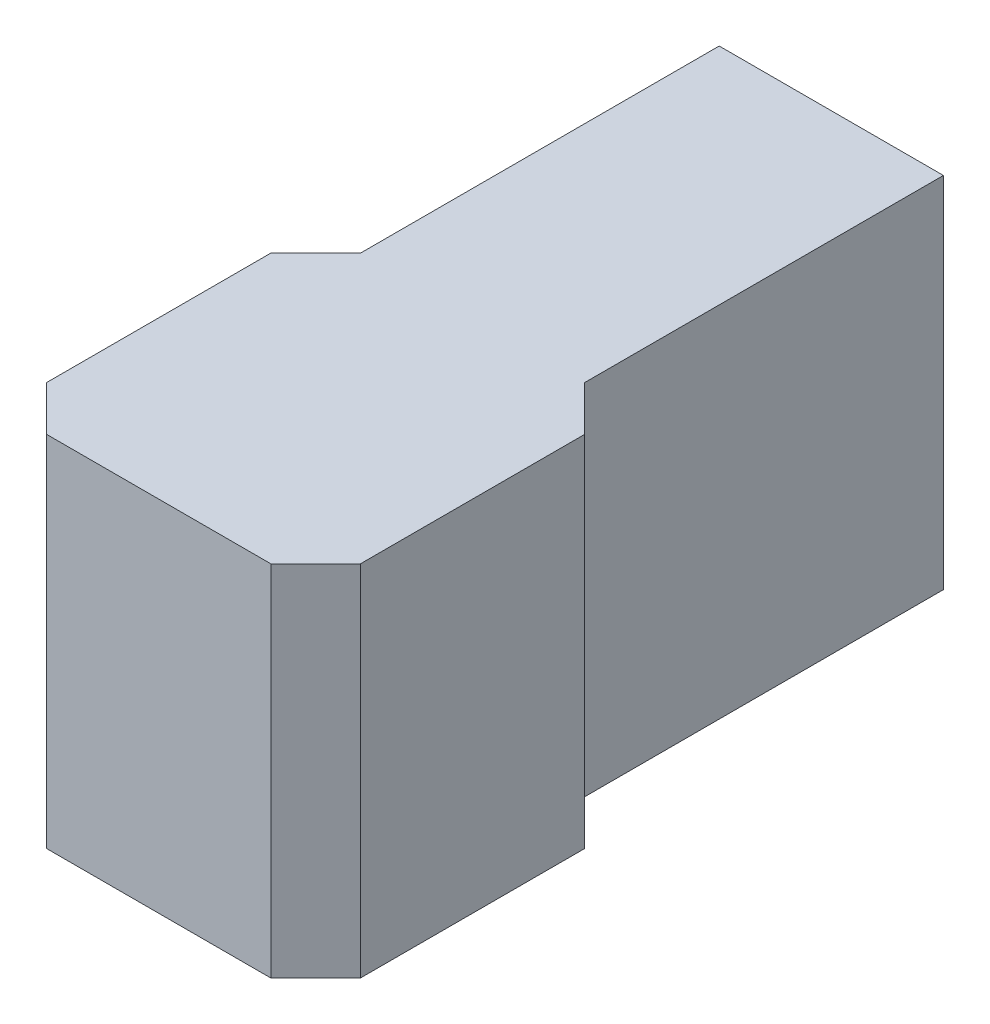
ISO-10303-21;
HEADER;
FILE_DESCRIPTION(('STEP AP214'),'2;1');
FILE_NAME('part.step','',(''),(''),'','','');
FILE_SCHEMA(('AUTOMOTIVE_DESIGN { 1 0 10303 214 1 1 1 1 }'));
ENDSEC;
DATA;
#1=APPLICATION_CONTEXT('core data for automotive mechanical design processes');
#2=APPLICATION_PROTOCOL_DEFINITION('international standard','automotive_design',2000,#1);
#3=PRODUCT_CONTEXT('',#1,'mechanical');
#4=PRODUCT('Part','Part','',(#3));
#5=PRODUCT_RELATED_PRODUCT_CATEGORY('part','',(#4));
#6=PRODUCT_DEFINITION_FORMATION('','',#4);
#7=PRODUCT_DEFINITION_CONTEXT('part definition',#1,'design');
#8=PRODUCT_DEFINITION('design','',#6,#7);
#9=PRODUCT_DEFINITION_SHAPE('','',#8);
#10=(LENGTH_UNIT() NAMED_UNIT(*) SI_UNIT(.MILLI.,.METRE.));
#11=(NAMED_UNIT(*) PLANE_ANGLE_UNIT() SI_UNIT($,.RADIAN.));
#12=(NAMED_UNIT(*) SI_UNIT($,.STERADIAN.) SOLID_ANGLE_UNIT());
#13=UNCERTAINTY_MEASURE_WITH_UNIT(LENGTH_MEASURE(1.E-05),#10,'distance_accuracy_value','');
#14=(GEOMETRIC_REPRESENTATION_CONTEXT(3) GLOBAL_UNCERTAINTY_ASSIGNED_CONTEXT((#13)) GLOBAL_UNIT_ASSIGNED_CONTEXT((#10,
#11,#12)) REPRESENTATION_CONTEXT('',''));
#15=CARTESIAN_POINT('',(0.,0.,0.));
#16=DIRECTION('',(0.,0.,1.));
#17=DIRECTION('',(1.,0.,0.));
#18=AXIS2_PLACEMENT_3D('',#15,#16,#17);
#19=CARTESIAN_POINT('',(0.,60.,5.));
#20=DIRECTION('',(0.,-1.,0.));
#21=DIRECTION('',(0.,0.,-1.));
#22=AXIS2_PLACEMENT_3D('',#19,#20,#21);
#23=PLANE('',#22);
#24=DIRECTION('',(0.,0.,-1.));
#25=VECTOR('',#24,1.);
#26=CARTESIAN_POINT('',(6.,60.,5.));
#27=LINE('',#26,#25);
#28=CARTESIAN_POINT('',(6.,60.,5.));
#29=VERTEX_POINT('',#28);
#30=CARTESIAN_POINT('',(6.,60.,-115.));
#31=VERTEX_POINT('',#30);
#32=EDGE_CURVE('E178',#29,#31,#27,.T.);
#33=ORIENTED_EDGE('',*,*,#32,.T.);
#34=DIRECTION('',(-1.,0.,0.));
#35=VECTOR('',#34,1.);
#36=CARTESIAN_POINT('',(6.,60.,-115.));
#37=LINE('',#36,#35);
#38=CARTESIAN_POINT('',(4.49999999999999,60.,-115.));
#39=VERTEX_POINT('',#38);
#40=EDGE_CURVE('E177',#31,#39,#37,.T.);
#41=ORIENTED_EDGE('',*,*,#40,.T.);
#42=DIRECTION('',(0.,0.,-1.));
#43=VECTOR('',#42,1.);
#44=CARTESIAN_POINT('',(4.5,60.,5.));
#45=LINE('',#44,#43);
#46=CARTESIAN_POINT('',(4.5,60.,5.));
#47=VERTEX_POINT('',#46);
#48=EDGE_CURVE('E162',#47,#39,#45,.T.);
#49=ORIENTED_EDGE('',*,*,#48,.F.);
#50=DIRECTION('',(-1.,0.,0.));
#51=VECTOR('',#50,1.);
#52=CARTESIAN_POINT('',(0.,60.,5.));
#53=LINE('',#52,#51);
#54=EDGE_CURVE('E225',#29,#47,#53,.T.);
#55=ORIENTED_EDGE('',*,*,#54,.F.);
#56=EDGE_LOOP('',(#33,#41,#49,#55));
#57=FACE_BOUND('',#56,.T.);
#58=ADVANCED_FACE('F35',(#57),#23,.F.);
#59=CARTESIAN_POINT('',(6.00000000000001,0.,5.));
#60=DIRECTION('',(-1.,0.,0.));
#61=DIRECTION('',(0.,-1.,0.));
#62=AXIS2_PLACEMENT_3D('',#59,#60,#61);
#63=PLANE('',#62);
#64=DIRECTION('',(0.,0.,-1.));
#65=VECTOR('',#64,1.);
#66=CARTESIAN_POINT('',(6.,70.,5.));
#67=LINE('',#66,#65);
#68=CARTESIAN_POINT('',(6.,70.,5.));
#69=VERTEX_POINT('',#68);
#70=CARTESIAN_POINT('',(6.,70.,-115.));
#71=VERTEX_POINT('',#70);
#72=EDGE_CURVE('E242',#69,#71,#67,.T.);
#73=ORIENTED_EDGE('',*,*,#72,.T.);
#74=DIRECTION('',(0.,-1.,0.));
#75=VECTOR('',#74,1.);
#76=CARTESIAN_POINT('',(6.,60.,-115.));
#77=LINE('',#76,#75);
#78=EDGE_CURVE('E202',#71,#31,#77,.T.);
#79=ORIENTED_EDGE('',*,*,#78,.T.);
#80=ORIENTED_EDGE('',*,*,#32,.F.);
#81=DIRECTION('',(0.,1.,0.));
#82=VECTOR('',#81,1.);
#83=CARTESIAN_POINT('',(6.00000000000001,0.,5.));
#84=LINE('',#83,#82);
#85=EDGE_CURVE('E174',#29,#69,#84,.T.);
#86=ORIENTED_EDGE('',*,*,#85,.T.);
#87=EDGE_LOOP('',(#73,#79,#80,#86));
#88=FACE_BOUND('',#87,.T.);
#89=ADVANCED_FACE('F348',(#88),#63,.T.);
#90=CARTESIAN_POINT('',(0.,70.,5.));
#91=DIRECTION('',(0.,-1.,0.));
#92=DIRECTION('',(0.,0.,-1.));
#93=AXIS2_PLACEMENT_3D('',#90,#91,#92);
#94=PLANE('',#93);
#95=DIRECTION('',(0.,0.,-1.));
#96=VECTOR('',#95,1.);
#97=CARTESIAN_POINT('',(-6.,70.,5.));
#98=LINE('',#97,#96);
#99=CARTESIAN_POINT('',(-6.,70.,5.));
#100=VERTEX_POINT('',#99);
#101=CARTESIAN_POINT('',(-6.,70.,-115.));
#102=VERTEX_POINT('',#101);
#103=EDGE_CURVE('E244',#100,#102,#98,.T.);
#104=ORIENTED_EDGE('',*,*,#103,.T.);
#105=DIRECTION('',(1.,0.,0.));
#106=VECTOR('',#105,1.);
#107=CARTESIAN_POINT('',(6.,70.,-115.));
#108=LINE('',#107,#106);
#109=EDGE_CURVE('E199',#102,#71,#108,.T.);
#110=ORIENTED_EDGE('',*,*,#109,.T.);
#111=ORIENTED_EDGE('',*,*,#72,.F.);
#112=DIRECTION('',(-1.,0.,0.));
#113=VECTOR('',#112,1.);
#114=CARTESIAN_POINT('',(0.,70.,5.));
#115=LINE('',#114,#113);
#116=EDGE_CURVE('E237',#69,#100,#115,.T.);
#117=ORIENTED_EDGE('',*,*,#116,.T.);
#118=EDGE_LOOP('',(#104,#110,#111,#117));
#119=FACE_BOUND('',#118,.T.);
#120=ADVANCED_FACE('F354',(#119),#94,.T.);
#121=CARTESIAN_POINT('',(-5.99999999999999,0.,5.));
#122=DIRECTION('',(-1.,0.,0.));
#123=DIRECTION('',(0.,-1.,0.));
#124=AXIS2_PLACEMENT_3D('',#121,#122,#123);
#125=PLANE('',#124);
#126=DIRECTION('',(0.,0.,-1.));
#127=VECTOR('',#126,1.);
#128=CARTESIAN_POINT('',(-6.,60.,5.));
#129=LINE('',#128,#127);
#130=CARTESIAN_POINT('',(-6.,60.,5.));
#131=VERTEX_POINT('',#130);
#132=CARTESIAN_POINT('',(-6.,60.,-115.));
#133=VERTEX_POINT('',#132);
#134=EDGE_CURVE('E246',#131,#133,#129,.T.);
#135=ORIENTED_EDGE('',*,*,#134,.T.);
#136=DIRECTION('',(0.,1.,0.));
#137=VECTOR('',#136,1.);
#138=CARTESIAN_POINT('',(-6.,60.,-115.));
#139=LINE('',#138,#137);
#140=EDGE_CURVE('E196',#133,#102,#139,.T.);
#141=ORIENTED_EDGE('',*,*,#140,.T.);
#142=ORIENTED_EDGE('',*,*,#103,.F.);
#143=DIRECTION('',(0.,1.,0.));
#144=VECTOR('',#143,1.);
#145=CARTESIAN_POINT('',(-5.99999999999999,0.,5.));
#146=LINE('',#145,#144);
#147=EDGE_CURVE('E234',#131,#100,#146,.T.);
#148=ORIENTED_EDGE('',*,*,#147,.F.);
#149=EDGE_LOOP('',(#135,#141,#142,#148));
#150=FACE_BOUND('',#149,.T.);
#151=ADVANCED_FACE('F361',(#150),#125,.F.);
#152=DIRECTION('',(0.,0.,-1.));
#153=VECTOR('',#152,1.);
#154=CARTESIAN_POINT('',(-4.5,60.,5.));
#155=LINE('',#154,#153);
#156=CARTESIAN_POINT('',(-4.5,60.,5.));
#157=VERTEX_POINT('',#156);
#158=CARTESIAN_POINT('',(-4.5,60.,-115.));
#159=VERTEX_POINT('',#158);
#160=EDGE_CURVE('E248',#157,#159,#155,.T.);
#161=ORIENTED_EDGE('',*,*,#160,.T.);
#162=DIRECTION('',(-1.,0.,0.));
#163=VECTOR('',#162,1.);
#164=CARTESIAN_POINT('',(-4.5,60.,-115.));
#165=LINE('',#164,#163);
#166=EDGE_CURVE('E193',#159,#133,#165,.T.);
#167=ORIENTED_EDGE('',*,*,#166,.T.);
#168=ORIENTED_EDGE('',*,*,#134,.F.);
#169=EDGE_CURVE('E227',#157,#131,#53,.T.);
#170=ORIENTED_EDGE('',*,*,#169,.F.);
#171=EDGE_LOOP('',(#161,#167,#168,#170));
#172=FACE_BOUND('',#171,.T.);
#173=ADVANCED_FACE('F350',(#172),#23,.F.);
#174=CARTESIAN_POINT('',(-4.49999999999999,0.,5.));
#175=DIRECTION('',(1.,0.,0.));
#176=DIRECTION('',(0.,1.,0.));
#177=AXIS2_PLACEMENT_3D('',#174,#175,#176);
#178=PLANE('',#177);
#179=DIRECTION('',(0.,0.,-1.));
#180=VECTOR('',#179,1.);
#181=CARTESIAN_POINT('',(-4.5,25.,5.));
#182=LINE('',#181,#180);
#183=CARTESIAN_POINT('',(-4.5,25.,5.));
#184=VERTEX_POINT('',#183);
#185=CARTESIAN_POINT('',(-4.5,25.,-115.));
#186=VERTEX_POINT('',#185);
#187=EDGE_CURVE('E250',#184,#186,#182,.T.);
#188=ORIENTED_EDGE('',*,*,#187,.T.);
#189=DIRECTION('',(0.,1.,0.));
#190=VECTOR('',#189,1.);
#191=CARTESIAN_POINT('',(-4.5,60.,-115.));
#192=LINE('',#191,#190);
#193=EDGE_CURVE('E188',#186,#159,#192,.T.);
#194=ORIENTED_EDGE('',*,*,#193,.T.);
#195=ORIENTED_EDGE('',*,*,#160,.F.);
#196=DIRECTION('',(0.,-1.,0.));
#197=VECTOR('',#196,1.);
#198=CARTESIAN_POINT('',(-4.49999999999999,0.,5.));
#199=LINE('',#198,#197);
#200=EDGE_CURVE('E232',#157,#184,#199,.T.);
#201=ORIENTED_EDGE('',*,*,#200,.T.);
#202=EDGE_LOOP('',(#188,#194,#195,#201));
#203=FACE_BOUND('',#202,.T.);
#204=ADVANCED_FACE('F360',(#203),#178,.T.);
#205=CARTESIAN_POINT('',(0.,25.,5.));
#206=DIRECTION('',(0.,-1.,0.));
#207=DIRECTION('',(0.,0.,-1.));
#208=AXIS2_PLACEMENT_3D('',#205,#206,#207);
#209=PLANE('',#208);
#210=DIRECTION('',(0.,0.,-1.));
#211=VECTOR('',#210,1.);
#212=CARTESIAN_POINT('',(4.5,25.,5.));
#213=LINE('',#212,#211);
#214=CARTESIAN_POINT('',(4.5,25.,5.));
#215=VERTEX_POINT('',#214);
#216=CARTESIAN_POINT('',(4.5,25.,-115.));
#217=VERTEX_POINT('',#216);
#218=EDGE_CURVE('E173',#215,#217,#213,.T.);
#219=ORIENTED_EDGE('',*,*,#218,.T.);
#220=DIRECTION('',(-1.,0.,0.));
#221=VECTOR('',#220,1.);
#222=CARTESIAN_POINT('',(4.5,25.,-115.));
#223=LINE('',#222,#221);
#224=EDGE_CURVE('E186',#217,#186,#223,.T.);
#225=ORIENTED_EDGE('',*,*,#224,.T.);
#226=ORIENTED_EDGE('',*,*,#187,.F.);
#227=DIRECTION('',(-1.,0.,0.));
#228=VECTOR('',#227,1.);
#229=CARTESIAN_POINT('',(0.,25.,5.));
#230=LINE('',#229,#228);
#231=EDGE_CURVE('E229',#215,#184,#230,.T.);
#232=ORIENTED_EDGE('',*,*,#231,.F.);
#233=EDGE_LOOP('',(#219,#225,#226,#232));
#234=FACE_BOUND('',#233,.T.);
#235=ADVANCED_FACE('F367',(#234),#209,.F.);
#236=CARTESIAN_POINT('',(4.49999999999999,0.,5.));
#237=DIRECTION('',(1.,0.,0.));
#238=DIRECTION('',(0.,1.,0.));
#239=AXIS2_PLACEMENT_3D('',#236,#237,#238);
#240=PLANE('',#239);
#241=ORIENTED_EDGE('',*,*,#48,.T.);
#242=DIRECTION('',(0.,-1.,0.));
#243=VECTOR('',#242,1.);
#244=CARTESIAN_POINT('',(4.49999999999999,60.,-115.));
#245=LINE('',#244,#243);
#246=EDGE_CURVE('E166',#39,#217,#245,.T.);
#247=ORIENTED_EDGE('',*,*,#246,.T.);
#248=ORIENTED_EDGE('',*,*,#218,.F.);
#249=DIRECTION('',(0.,-1.,0.));
#250=VECTOR('',#249,1.);
#251=CARTESIAN_POINT('',(4.49999999999999,0.,5.));
#252=LINE('',#251,#250);
#253=EDGE_CURVE('E169',#47,#215,#252,.T.);
#254=ORIENTED_EDGE('',*,*,#253,.F.);
#255=EDGE_LOOP('',(#241,#247,#248,#254));
#256=FACE_BOUND('',#255,.T.);
#257=ADVANCED_FACE('F164',(#256),#240,.F.);
#258=CARTESIAN_POINT('',(0.,0.,5.));
#259=DIRECTION('',(0.,0.,-1.));
#260=DIRECTION('',(-1.,0.,0.));
#261=AXIS2_PLACEMENT_3D('',#258,#259,#260);
#262=PLANE('',#261);
#263=ORIENTED_EDGE('',*,*,#54,.T.);
#264=ORIENTED_EDGE('',*,*,#253,.T.);
#265=ORIENTED_EDGE('',*,*,#231,.T.);
#266=ORIENTED_EDGE('',*,*,#200,.F.);
#267=ORIENTED_EDGE('',*,*,#169,.T.);
#268=ORIENTED_EDGE('',*,*,#147,.T.);
#269=ORIENTED_EDGE('',*,*,#116,.F.);
#270=ORIENTED_EDGE('',*,*,#85,.F.);
#271=EDGE_LOOP('',(#263,#264,#265,#266,#267,#268,#269,#270));
#272=FACE_BOUND('',#271,.T.);
#273=ADVANCED_FACE('F381',(#272),#262,.T.);
#274=CARTESIAN_POINT('',(0.,0.,-115.));
#275=DIRECTION('',(0.,0.,-1.));
#276=DIRECTION('',(-1.,0.,0.));
#277=AXIS2_PLACEMENT_3D('',#274,#275,#276);
#278=PLANE('',#277);
#279=DIRECTION('',(0.,-1.,0.));
#280=VECTOR('',#279,1.);
#281=CARTESIAN_POINT('',(25.,80.,-115.));
#282=LINE('',#281,#280);
#283=CARTESIAN_POINT('',(25.,80.,-115.));
#284=VERTEX_POINT('',#283);
#285=CARTESIAN_POINT('',(25.,0.,-115.));
#286=VERTEX_POINT('',#285);
#287=EDGE_CURVE('E204',#284,#286,#282,.T.);
#288=ORIENTED_EDGE('',*,*,#287,.T.);
#289=DIRECTION('',(-1.,0.,0.));
#290=VECTOR('',#289,1.);
#291=CARTESIAN_POINT('',(25.,0.,-115.));
#292=LINE('',#291,#290);
#293=CARTESIAN_POINT('',(-25.,0.,-115.));
#294=VERTEX_POINT('',#293);
#295=EDGE_CURVE('E207',#286,#294,#292,.T.);
#296=ORIENTED_EDGE('',*,*,#295,.T.);
#297=DIRECTION('',(0.,1.,0.));
#298=VECTOR('',#297,1.);
#299=CARTESIAN_POINT('',(-25.,0.,-115.));
#300=LINE('',#299,#298);
#301=CARTESIAN_POINT('',(-25.,80.,-115.));
#302=VERTEX_POINT('',#301);
#303=EDGE_CURVE('E209',#294,#302,#300,.T.);
#304=ORIENTED_EDGE('',*,*,#303,.T.);
#305=DIRECTION('',(1.,0.,0.));
#306=VECTOR('',#305,1.);
#307=CARTESIAN_POINT('',(-25.,80.,-115.));
#308=LINE('',#307,#306);
#309=EDGE_CURVE('E211',#302,#284,#308,.T.);
#310=ORIENTED_EDGE('',*,*,#309,.T.);
#311=EDGE_LOOP('',(#288,#296,#304,#310));
#312=FACE_BOUND('',#311,.T.);
#313=ORIENTED_EDGE('',*,*,#246,.F.);
#314=ORIENTED_EDGE('',*,*,#40,.F.);
#315=ORIENTED_EDGE('',*,*,#78,.F.);
#316=ORIENTED_EDGE('',*,*,#109,.F.);
#317=ORIENTED_EDGE('',*,*,#140,.F.);
#318=ORIENTED_EDGE('',*,*,#166,.F.);
#319=ORIENTED_EDGE('',*,*,#193,.F.);
#320=ORIENTED_EDGE('',*,*,#224,.F.);
#321=EDGE_LOOP('',(#313,#314,#315,#316,#317,#318,#319,#320));
#322=FACE_BOUND('',#321,.T.);
#323=ADVANCED_FACE('F183',(#312,#322),#278,.T.);
#324=CARTESIAN_POINT('',(25.,80.,-115.));
#325=DIRECTION('',(-1.,0.,0.));
#326=DIRECTION('',(0.,0.,1.));
#327=AXIS2_PLACEMENT_3D('',#324,#325,#326);
#328=PLANE('',#327);
#329=DIRECTION('',(0.,-1.,0.));
#330=VECTOR('',#329,1.);
#331=CARTESIAN_POINT('',(25.,80.,-35.));
#332=LINE('',#331,#330);
#333=CARTESIAN_POINT('',(25.,80.,-35.));
#334=VERTEX_POINT('',#333);
#335=CARTESIAN_POINT('',(25.,0.,-35.));
#336=VERTEX_POINT('',#335);
#337=EDGE_CURVE('E280',#334,#336,#332,.T.);
#338=ORIENTED_EDGE('',*,*,#337,.T.);
#339=DIRECTION('',(0.,0.,1.));
#340=VECTOR('',#339,1.);
#341=CARTESIAN_POINT('',(25.,0.,-115.));
#342=LINE('',#341,#340);
#343=EDGE_CURVE('E222',#286,#336,#342,.T.);
#344=ORIENTED_EDGE('',*,*,#343,.F.);
#345=ORIENTED_EDGE('',*,*,#287,.F.);
#346=DIRECTION('',(0.,0.,1.));
#347=VECTOR('',#346,1.);
#348=CARTESIAN_POINT('',(25.,80.,-115.));
#349=LINE('',#348,#347);
#350=EDGE_CURVE('E213',#284,#334,#349,.T.);
#351=ORIENTED_EDGE('',*,*,#350,.T.);
#352=EDGE_LOOP('',(#338,#344,#345,#351));
#353=FACE_BOUND('',#352,.T.);
#354=ADVANCED_FACE('F313',(#353),#328,.F.);
#355=CARTESIAN_POINT('',(-25.,0.,-115.));
#356=DIRECTION('',(1.,0.,0.));
#357=DIRECTION('',(0.,0.,-1.));
#358=AXIS2_PLACEMENT_3D('',#355,#356,#357);
#359=PLANE('',#358);
#360=DIRECTION('',(0.,1.,0.));
#361=VECTOR('',#360,1.);
#362=CARTESIAN_POINT('',(-25.,80.,-35.));
#363=LINE('',#362,#361);
#364=CARTESIAN_POINT('',(-25.,0.,-35.));
#365=VERTEX_POINT('',#364);
#366=CARTESIAN_POINT('',(-25.,80.,-35.));
#367=VERTEX_POINT('',#366);
#368=EDGE_CURVE('E283',#365,#367,#363,.T.);
#369=ORIENTED_EDGE('',*,*,#368,.T.);
#370=DIRECTION('',(0.,0.,1.));
#371=VECTOR('',#370,1.);
#372=CARTESIAN_POINT('',(-25.,80.,-115.));
#373=LINE('',#372,#371);
#374=EDGE_CURVE('E216',#302,#367,#373,.T.);
#375=ORIENTED_EDGE('',*,*,#374,.F.);
#376=ORIENTED_EDGE('',*,*,#303,.F.);
#377=DIRECTION('',(0.,0.,1.));
#378=VECTOR('',#377,1.);
#379=CARTESIAN_POINT('',(-25.,0.,-115.));
#380=LINE('',#379,#378);
#381=EDGE_CURVE('E219',#294,#365,#380,.T.);
#382=ORIENTED_EDGE('',*,*,#381,.T.);
#383=EDGE_LOOP('',(#369,#375,#376,#382));
#384=FACE_BOUND('',#383,.T.);
#385=ADVANCED_FACE('F320',(#384),#359,.F.);
#386=CARTESIAN_POINT('',(35.,80.,25.));
#387=DIRECTION('',(-0.707106781186547,0.,-0.707106781186549));
#388=DIRECTION('',(0.,-1.,0.));
#389=AXIS2_PLACEMENT_3D('',#386,#387,#388);
#390=PLANE('',#389);
#391=DIRECTION('',(-0.707106781186549,0.,0.707106781186547));
#392=VECTOR('',#391,1.);
#393=CARTESIAN_POINT('',(30.,80.,30.));
#394=LINE('',#393,#392);
#395=CARTESIAN_POINT('',(25.,80.,35.));
#396=VERTEX_POINT('',#395);
#397=CARTESIAN_POINT('',(35.,80.,25.));
#398=VERTEX_POINT('',#397);
#399=EDGE_CURVE('E286',#396,#398,#394,.F.);
#400=ORIENTED_EDGE('',*,*,#399,.F.);
#401=DIRECTION('',(0.,1.,0.));
#402=VECTOR('',#401,1.);
#403=CARTESIAN_POINT('',(25.,80.,35.));
#404=LINE('',#403,#402);
#405=CARTESIAN_POINT('',(25.,0.,35.));
#406=VERTEX_POINT('',#405);
#407=EDGE_CURVE('E44',#406,#396,#404,.T.);
#408=ORIENTED_EDGE('',*,*,#407,.F.);
#409=DIRECTION('',(0.707106781186549,0.,-0.707106781186547));
#410=VECTOR('',#409,1.);
#411=CARTESIAN_POINT('',(35.,0.,25.));
#412=LINE('',#411,#410);
#413=CARTESIAN_POINT('',(35.,0.,25.));
#414=VERTEX_POINT('',#413);
#415=EDGE_CURVE('E272',#414,#406,#412,.F.);
#416=ORIENTED_EDGE('',*,*,#415,.F.);
#417=DIRECTION('',(0.,-1.,0.));
#418=VECTOR('',#417,1.);
#419=CARTESIAN_POINT('',(35.,80.,25.));
#420=LINE('',#419,#418);
#421=EDGE_CURVE('E293',#398,#414,#420,.T.);
#422=ORIENTED_EDGE('',*,*,#421,.F.);
#423=EDGE_LOOP('',(#400,#408,#416,#422));
#424=FACE_BOUND('',#423,.T.);
#425=ADVANCED_FACE('F38',(#424),#390,.F.);
#426=CARTESIAN_POINT('',(-35.,80.,35.));
#427=DIRECTION('',(0.,0.,-1.));
#428=DIRECTION('',(-1.,0.,0.));
#429=AXIS2_PLACEMENT_3D('',#426,#427,#428);
#430=PLANE('',#429);
#431=DIRECTION('',(1.,0.,0.));
#432=VECTOR('',#431,1.);
#433=CARTESIAN_POINT('',(-35.,80.,35.));
#434=LINE('',#433,#432);
#435=CARTESIAN_POINT('',(-25.,80.,35.));
#436=VERTEX_POINT('',#435);
#437=EDGE_CURVE('E259',#436,#396,#434,.T.);
#438=ORIENTED_EDGE('',*,*,#437,.F.);
#439=DIRECTION('',(0.,-1.,0.));
#440=VECTOR('',#439,1.);
#441=CARTESIAN_POINT('',(-25.,80.,35.));
#442=LINE('',#441,#440);
#443=CARTESIAN_POINT('',(-25.,0.,35.));
#444=VERTEX_POINT('',#443);
#445=EDGE_CURVE('E11',#436,#444,#442,.T.);
#446=ORIENTED_EDGE('',*,*,#445,.T.);
#447=DIRECTION('',(1.,0.,0.));
#448=VECTOR('',#447,1.);
#449=CARTESIAN_POINT('',(-35.,0.,35.));
#450=LINE('',#449,#448);
#451=EDGE_CURVE('E257',#444,#406,#450,.T.);
#452=ORIENTED_EDGE('',*,*,#451,.T.);
#453=ORIENTED_EDGE('',*,*,#407,.T.);
#454=EDGE_LOOP('',(#438,#446,#452,#453));
#455=FACE_BOUND('',#454,.T.);
#456=ADVANCED_FACE('F334',(#455),#430,.F.);
#457=CARTESIAN_POINT('',(-25.,80.,35.));
#458=DIRECTION('',(0.707106781186549,0.,-0.707106781186547));
#459=DIRECTION('',(0.,-1.,0.));
#460=AXIS2_PLACEMENT_3D('',#457,#458,#459);
#461=PLANE('',#460);
#462=DIRECTION('',(-0.707106781186547,0.,-0.707106781186549));
#463=VECTOR('',#462,1.);
#464=CARTESIAN_POINT('',(-30.,80.,30.));
#465=LINE('',#464,#463);
#466=CARTESIAN_POINT('',(-35.,80.,25.));
#467=VERTEX_POINT('',#466);
#468=EDGE_CURVE('E57',#467,#436,#465,.F.);
#469=ORIENTED_EDGE('',*,*,#468,.F.);
#470=DIRECTION('',(0.,1.,0.));
#471=VECTOR('',#470,1.);
#472=CARTESIAN_POINT('',(-35.,80.,25.));
#473=LINE('',#472,#471);
#474=CARTESIAN_POINT('',(-35.,0.,25.));
#475=VERTEX_POINT('',#474);
#476=EDGE_CURVE('E261',#475,#467,#473,.T.);
#477=ORIENTED_EDGE('',*,*,#476,.F.);
#478=DIRECTION('',(0.707106781186547,0.,0.707106781186549));
#479=VECTOR('',#478,1.);
#480=CARTESIAN_POINT('',(-25.,0.,35.));
#481=LINE('',#480,#479);
#482=EDGE_CURVE('E274',#444,#475,#481,.F.);
#483=ORIENTED_EDGE('',*,*,#482,.F.);
#484=ORIENTED_EDGE('',*,*,#445,.F.);
#485=EDGE_LOOP('',(#469,#477,#483,#484));
#486=FACE_BOUND('',#485,.T.);
#487=ADVANCED_FACE('F331',(#486),#461,.F.);
#488=CARTESIAN_POINT('',(-35.,80.,-35.));
#489=DIRECTION('',(1.,0.,0.));
#490=DIRECTION('',(0.,0.,-1.));
#491=AXIS2_PLACEMENT_3D('',#488,#489,#490);
#492=PLANE('',#491);
#493=DIRECTION('',(0.,0.,1.));
#494=VECTOR('',#493,1.);
#495=CARTESIAN_POINT('',(-35.,80.,-35.));
#496=LINE('',#495,#494);
#497=CARTESIAN_POINT('',(-35.,80.,-25.));
#498=VERTEX_POINT('',#497);
#499=EDGE_CURVE('E256',#498,#467,#496,.T.);
#500=ORIENTED_EDGE('',*,*,#499,.F.);
#501=DIRECTION('',(0.,-1.,0.));
#502=VECTOR('',#501,1.);
#503=CARTESIAN_POINT('',(-35.,80.,-25.));
#504=LINE('',#503,#502);
#505=CARTESIAN_POINT('',(-35.,0.,-25.));
#506=VERTEX_POINT('',#505);
#507=EDGE_CURVE('E269',#498,#506,#504,.T.);
#508=ORIENTED_EDGE('',*,*,#507,.T.);
#509=DIRECTION('',(0.,0.,1.));
#510=VECTOR('',#509,1.);
#511=CARTESIAN_POINT('',(-35.,0.,-35.));
#512=LINE('',#511,#510);
#513=EDGE_CURVE('E264',#506,#475,#512,.T.);
#514=ORIENTED_EDGE('',*,*,#513,.T.);
#515=ORIENTED_EDGE('',*,*,#476,.T.);
#516=EDGE_LOOP('',(#500,#508,#514,#515));
#517=FACE_BOUND('',#516,.T.);
#518=ADVANCED_FACE('F327',(#517),#492,.F.);
#519=CARTESIAN_POINT('',(35.,80.,-35.));
#520=DIRECTION('',(-1.,0.,0.));
#521=DIRECTION('',(0.,0.,1.));
#522=AXIS2_PLACEMENT_3D('',#519,#520,#521);
#523=PLANE('',#522);
#524=DIRECTION('',(0.,0.,-1.));
#525=VECTOR('',#524,1.);
#526=CARTESIAN_POINT('',(35.,0.,-35.));
#527=LINE('',#526,#525);
#528=CARTESIAN_POINT('',(35.,0.,-25.));
#529=VERTEX_POINT('',#528);
#530=EDGE_CURVE('E241',#414,#529,#527,.T.);
#531=ORIENTED_EDGE('',*,*,#530,.T.);
#532=DIRECTION('',(0.,1.,0.));
#533=VECTOR('',#532,1.);
#534=CARTESIAN_POINT('',(35.,80.,-25.));
#535=LINE('',#534,#533);
#536=CARTESIAN_POINT('',(35.,80.,-25.));
#537=VERTEX_POINT('',#536);
#538=EDGE_CURVE('E296',#529,#537,#535,.T.);
#539=ORIENTED_EDGE('',*,*,#538,.T.);
#540=DIRECTION('',(0.,0.,-1.));
#541=VECTOR('',#540,1.);
#542=CARTESIAN_POINT('',(35.,80.,-35.));
#543=LINE('',#542,#541);
#544=EDGE_CURVE('E253',#398,#537,#543,.T.);
#545=ORIENTED_EDGE('',*,*,#544,.F.);
#546=ORIENTED_EDGE('',*,*,#421,.T.);
#547=EDGE_LOOP('',(#531,#539,#545,#546));
#548=FACE_BOUND('',#547,.T.);
#549=ADVANCED_FACE('F300',(#548),#523,.F.);
#550=CARTESIAN_POINT('',(25.,80.,-35.));
#551=DIRECTION('',(-0.707106781186549,0.,0.707106781186547));
#552=DIRECTION('',(0.,-1.,0.));
#553=AXIS2_PLACEMENT_3D('',#550,#551,#552);
#554=PLANE('',#553);
#555=DIRECTION('',(0.707106781186547,0.,0.707106781186549));
#556=VECTOR('',#555,1.);
#557=CARTESIAN_POINT('',(30.,80.,-30.));
#558=LINE('',#557,#556);
#559=EDGE_CURVE('E289',#537,#334,#558,.F.);
#560=ORIENTED_EDGE('',*,*,#559,.F.);
#561=ORIENTED_EDGE('',*,*,#538,.F.);
#562=DIRECTION('',(-0.707106781186547,0.,-0.707106781186549));
#563=VECTOR('',#562,1.);
#564=CARTESIAN_POINT('',(25.,0.,-35.));
#565=LINE('',#564,#563);
#566=EDGE_CURVE('E276',#336,#529,#565,.F.);
#567=ORIENTED_EDGE('',*,*,#566,.F.);
#568=ORIENTED_EDGE('',*,*,#337,.F.);
#569=EDGE_LOOP('',(#560,#561,#567,#568));
#570=FACE_BOUND('',#569,.T.);
#571=ADVANCED_FACE('F309',(#570),#554,.F.);
#572=CARTESIAN_POINT('',(0.,80.,0.));
#573=DIRECTION('',(0.,1.,0.));
#574=DIRECTION('',(0.,0.,1.));
#575=AXIS2_PLACEMENT_3D('',#572,#573,#574);
#576=PLANE('',#575);
#577=ORIENTED_EDGE('',*,*,#559,.T.);
#578=ORIENTED_EDGE('',*,*,#350,.F.);
#579=ORIENTED_EDGE('',*,*,#309,.F.);
#580=ORIENTED_EDGE('',*,*,#374,.T.);
#581=DIRECTION('',(0.707106781186549,0.,-0.707106781186547));
#582=VECTOR('',#581,1.);
#583=CARTESIAN_POINT('',(-30.,80.,-30.));
#584=LINE('',#583,#582);
#585=EDGE_CURVE('E291',#367,#498,#584,.F.);
#586=ORIENTED_EDGE('',*,*,#585,.T.);
#587=ORIENTED_EDGE('',*,*,#499,.T.);
#588=ORIENTED_EDGE('',*,*,#468,.T.);
#589=ORIENTED_EDGE('',*,*,#437,.T.);
#590=ORIENTED_EDGE('',*,*,#399,.T.);
#591=ORIENTED_EDGE('',*,*,#544,.T.);
#592=EDGE_LOOP('',(#577,#578,#579,#580,#586,#587,#588,#589,#590,#591));
#593=FACE_BOUND('',#592,.T.);
#594=ADVANCED_FACE('F305',(#593),#576,.T.);
#595=CARTESIAN_POINT('',(-35.,80.,-25.));
#596=DIRECTION('',(0.707106781186547,0.,0.707106781186549));
#597=DIRECTION('',(0.,-1.,0.));
#598=AXIS2_PLACEMENT_3D('',#595,#596,#597);
#599=PLANE('',#598);
#600=ORIENTED_EDGE('',*,*,#585,.F.);
#601=ORIENTED_EDGE('',*,*,#368,.F.);
#602=DIRECTION('',(-0.707106781186549,0.,0.707106781186547));
#603=VECTOR('',#602,1.);
#604=CARTESIAN_POINT('',(-35.,0.,-25.));
#605=LINE('',#604,#603);
#606=EDGE_CURVE('E278',#506,#365,#605,.F.);
#607=ORIENTED_EDGE('',*,*,#606,.F.);
#608=ORIENTED_EDGE('',*,*,#507,.F.);
#609=EDGE_LOOP('',(#600,#601,#607,#608));
#610=FACE_BOUND('',#609,.T.);
#611=ADVANCED_FACE('F323',(#610),#599,.F.);
#612=CARTESIAN_POINT('',(0.,0.,0.));
#613=DIRECTION('',(0.,1.,0.));
#614=DIRECTION('',(0.,0.,1.));
#615=AXIS2_PLACEMENT_3D('',#612,#613,#614);
#616=PLANE('',#615);
#617=ORIENTED_EDGE('',*,*,#513,.F.);
#618=ORIENTED_EDGE('',*,*,#606,.T.);
#619=ORIENTED_EDGE('',*,*,#381,.F.);
#620=ORIENTED_EDGE('',*,*,#295,.F.);
#621=ORIENTED_EDGE('',*,*,#343,.T.);
#622=ORIENTED_EDGE('',*,*,#566,.T.);
#623=ORIENTED_EDGE('',*,*,#530,.F.);
#624=ORIENTED_EDGE('',*,*,#415,.T.);
#625=ORIENTED_EDGE('',*,*,#451,.F.);
#626=ORIENTED_EDGE('',*,*,#482,.T.);
#627=EDGE_LOOP('',(#617,#618,#619,#620,#621,#622,#623,#624,#625,#626));
#628=FACE_BOUND('',#627,.T.);
#629=ADVANCED_FACE('F336',(#628),#616,.F.);
#630=CLOSED_SHELL('',(#58,#89,#120,#151,#173,#204,#235,#257,#273,#323,#354,#385,#425,#456,#487,
#518,#549,#571,#594,#611,#629));
#631=MANIFOLD_SOLID_BREP('B2',#630);
#632=ADVANCED_BREP_SHAPE_REPRESENTATION('',(#18,#631),#14);
#633=SHAPE_DEFINITION_REPRESENTATION(#9,#632);
ENDSEC;
END-ISO-10303-21;
